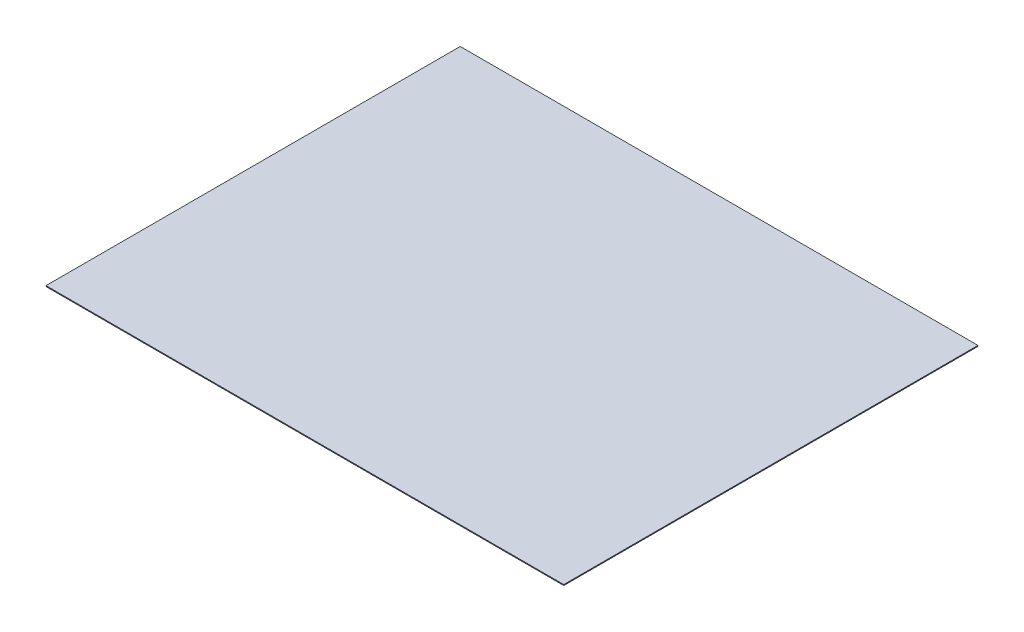
ISO-10303-21;
HEADER;
FILE_DESCRIPTION(('STEP AP214'),'2;1');
FILE_NAME('part.step','',(''),(''),'','','');
FILE_SCHEMA(('AUTOMOTIVE_DESIGN { 1 0 10303 214 1 1 1 1 }'));
ENDSEC;
DATA;
#1=APPLICATION_CONTEXT('core data for automotive mechanical design processes');
#2=APPLICATION_PROTOCOL_DEFINITION('international standard','automotive_design',2000,#1);
#3=PRODUCT_CONTEXT('',#1,'mechanical');
#4=PRODUCT('Part','Part','',(#3));
#5=PRODUCT_RELATED_PRODUCT_CATEGORY('part','',(#4));
#6=PRODUCT_DEFINITION_FORMATION('','',#4);
#7=PRODUCT_DEFINITION_CONTEXT('part definition',#1,'design');
#8=PRODUCT_DEFINITION('design','',#6,#7);
#9=PRODUCT_DEFINITION_SHAPE('','',#8);
#10=(LENGTH_UNIT() NAMED_UNIT(*) SI_UNIT(.MILLI.,.METRE.));
#11=(NAMED_UNIT(*) PLANE_ANGLE_UNIT() SI_UNIT($,.RADIAN.));
#12=(NAMED_UNIT(*) SI_UNIT($,.STERADIAN.) SOLID_ANGLE_UNIT());
#13=UNCERTAINTY_MEASURE_WITH_UNIT(LENGTH_MEASURE(1.E-05),#10,'distance_accuracy_value','');
#14=(GEOMETRIC_REPRESENTATION_CONTEXT(3) GLOBAL_UNCERTAINTY_ASSIGNED_CONTEXT((#13)) GLOBAL_UNIT_ASSIGNED_CONTEXT((#10,
#11,#12)) REPRESENTATION_CONTEXT('',''));
#15=CARTESIAN_POINT('',(0.,0.,0.));
#16=DIRECTION('',(0.,0.,1.));
#17=DIRECTION('',(1.,0.,0.));
#18=AXIS2_PLACEMENT_3D('',#15,#16,#17);
#19=CARTESIAN_POINT('',(762.,2.54,-609.6));
#20=DIRECTION('',(-1.,0.,0.));
#21=DIRECTION('',(0.,0.,1.));
#22=AXIS2_PLACEMENT_3D('',#19,#20,#21);
#23=PLANE('',#22);
#24=DIRECTION('',(0.,0.,-1.));
#25=VECTOR('',#24,1.);
#26=CARTESIAN_POINT('',(762.,0.,-609.6));
#27=LINE('',#26,#25);
#28=CARTESIAN_POINT('',(762.,0.,609.6));
#29=VERTEX_POINT('',#28);
#30=CARTESIAN_POINT('',(762.,0.,-609.6));
#31=VERTEX_POINT('',#30);
#32=EDGE_CURVE('E96',#29,#31,#27,.T.);
#33=ORIENTED_EDGE('',*,*,#32,.T.);
#34=DIRECTION('',(0.,-1.,0.));
#35=VECTOR('',#34,1.);
#36=CARTESIAN_POINT('',(762.,2.54,-609.6));
#37=LINE('',#36,#35);
#38=CARTESIAN_POINT('',(762.,2.54,-609.6));
#39=VERTEX_POINT('',#38);
#40=EDGE_CURVE('E11',#39,#31,#37,.T.);
#41=ORIENTED_EDGE('',*,*,#40,.F.);
#42=DIRECTION('',(0.,0.,-1.));
#43=VECTOR('',#42,1.);
#44=CARTESIAN_POINT('',(762.,2.54,-609.6));
#45=LINE('',#44,#43);
#46=CARTESIAN_POINT('',(762.,2.54,609.6));
#47=VERTEX_POINT('',#46);
#48=EDGE_CURVE('E84',#47,#39,#45,.T.);
#49=ORIENTED_EDGE('',*,*,#48,.F.);
#50=DIRECTION('',(0.,-1.,0.));
#51=VECTOR('',#50,1.);
#52=CARTESIAN_POINT('',(762.,2.54,609.6));
#53=LINE('',#52,#51);
#54=EDGE_CURVE('E92',#47,#29,#53,.T.);
#55=ORIENTED_EDGE('',*,*,#54,.T.);
#56=EDGE_LOOP('',(#33,#41,#49,#55));
#57=FACE_BOUND('',#56,.T.);
#58=ADVANCED_FACE('F33',(#57),#23,.F.);
#59=CARTESIAN_POINT('',(-762.,2.54,-609.6));
#60=DIRECTION('',(0.,0.,1.));
#61=DIRECTION('',(1.,0.,0.));
#62=AXIS2_PLACEMENT_3D('',#59,#60,#61);
#63=PLANE('',#62);
#64=DIRECTION('',(-1.,0.,0.));
#65=VECTOR('',#64,1.);
#66=CARTESIAN_POINT('',(-762.,0.,-609.6));
#67=LINE('',#66,#65);
#68=CARTESIAN_POINT('',(-762.,0.,-609.6));
#69=VERTEX_POINT('',#68);
#70=EDGE_CURVE('E88',#31,#69,#67,.T.);
#71=ORIENTED_EDGE('',*,*,#70,.T.);
#72=DIRECTION('',(0.,-1.,0.));
#73=VECTOR('',#72,1.);
#74=CARTESIAN_POINT('',(-762.,2.54,-609.6));
#75=LINE('',#74,#73);
#76=CARTESIAN_POINT('',(-762.,2.54,-609.6));
#77=VERTEX_POINT('',#76);
#78=EDGE_CURVE('E41',#77,#69,#75,.T.);
#79=ORIENTED_EDGE('',*,*,#78,.F.);
#80=DIRECTION('',(-1.,0.,0.));
#81=VECTOR('',#80,1.);
#82=CARTESIAN_POINT('',(-762.,2.54,-609.6));
#83=LINE('',#82,#81);
#84=EDGE_CURVE('E79',#39,#77,#83,.T.);
#85=ORIENTED_EDGE('',*,*,#84,.F.);
#86=ORIENTED_EDGE('',*,*,#40,.T.);
#87=EDGE_LOOP('',(#71,#79,#85,#86));
#88=FACE_BOUND('',#87,.T.);
#89=ADVANCED_FACE('F87',(#88),#63,.F.);
#90=CARTESIAN_POINT('',(-762.,2.54,-609.6));
#91=DIRECTION('',(1.,0.,0.));
#92=DIRECTION('',(0.,0.,-1.));
#93=AXIS2_PLACEMENT_3D('',#90,#91,#92);
#94=PLANE('',#93);
#95=DIRECTION('',(0.,0.,1.));
#96=VECTOR('',#95,1.);
#97=CARTESIAN_POINT('',(-762.,0.,-609.6));
#98=LINE('',#97,#96);
#99=CARTESIAN_POINT('',(-762.,0.,609.6));
#100=VERTEX_POINT('',#99);
#101=EDGE_CURVE('E66',#69,#100,#98,.T.);
#102=ORIENTED_EDGE('',*,*,#101,.T.);
#103=DIRECTION('',(0.,-1.,0.));
#104=VECTOR('',#103,1.);
#105=CARTESIAN_POINT('',(-762.,2.54,609.6));
#106=LINE('',#105,#104);
#107=CARTESIAN_POINT('',(-762.,2.54,609.6));
#108=VERTEX_POINT('',#107);
#109=EDGE_CURVE('E89',#108,#100,#106,.T.);
#110=ORIENTED_EDGE('',*,*,#109,.F.);
#111=DIRECTION('',(0.,0.,1.));
#112=VECTOR('',#111,1.);
#113=CARTESIAN_POINT('',(-762.,2.54,-609.6));
#114=LINE('',#113,#112);
#115=EDGE_CURVE('E82',#77,#108,#114,.T.);
#116=ORIENTED_EDGE('',*,*,#115,.F.);
#117=ORIENTED_EDGE('',*,*,#78,.T.);
#118=EDGE_LOOP('',(#102,#110,#116,#117));
#119=FACE_BOUND('',#118,.T.);
#120=ADVANCED_FACE('F90',(#119),#94,.F.);
#121=CARTESIAN_POINT('',(-762.,2.54,609.6));
#122=DIRECTION('',(0.,0.,-1.));
#123=DIRECTION('',(-1.,0.,0.));
#124=AXIS2_PLACEMENT_3D('',#121,#122,#123);
#125=PLANE('',#124);
#126=DIRECTION('',(1.,0.,0.));
#127=VECTOR('',#126,1.);
#128=CARTESIAN_POINT('',(-762.,0.,609.6));
#129=LINE('',#128,#127);
#130=EDGE_CURVE('E72',#100,#29,#129,.T.);
#131=ORIENTED_EDGE('',*,*,#130,.T.);
#132=ORIENTED_EDGE('',*,*,#54,.F.);
#133=DIRECTION('',(1.,0.,0.));
#134=VECTOR('',#133,1.);
#135=CARTESIAN_POINT('',(-762.,2.54,609.6));
#136=LINE('',#135,#134);
#137=EDGE_CURVE('E49',#108,#47,#136,.T.);
#138=ORIENTED_EDGE('',*,*,#137,.F.);
#139=ORIENTED_EDGE('',*,*,#109,.T.);
#140=EDGE_LOOP('',(#131,#132,#138,#139));
#141=FACE_BOUND('',#140,.T.);
#142=ADVANCED_FACE('F103',(#141),#125,.F.);
#143=CARTESIAN_POINT('',(0.,2.54,0.));
#144=DIRECTION('',(0.,1.,0.));
#145=DIRECTION('',(0.,0.,1.));
#146=AXIS2_PLACEMENT_3D('',#143,#144,#145);
#147=PLANE('',#146);
#148=ORIENTED_EDGE('',*,*,#48,.T.);
#149=ORIENTED_EDGE('',*,*,#84,.T.);
#150=ORIENTED_EDGE('',*,*,#115,.T.);
#151=ORIENTED_EDGE('',*,*,#137,.T.);
#152=EDGE_LOOP('',(#148,#149,#150,#151));
#153=FACE_BOUND('',#152,.T.);
#154=ADVANCED_FACE('F80',(#153),#147,.T.);
#155=CARTESIAN_POINT('',(0.,0.,0.));
#156=DIRECTION('',(0.,1.,0.));
#157=DIRECTION('',(0.,0.,1.));
#158=AXIS2_PLACEMENT_3D('',#155,#156,#157);
#159=PLANE('',#158);
#160=ORIENTED_EDGE('',*,*,#32,.F.);
#161=ORIENTED_EDGE('',*,*,#130,.F.);
#162=ORIENTED_EDGE('',*,*,#101,.F.);
#163=ORIENTED_EDGE('',*,*,#70,.F.);
#164=EDGE_LOOP('',(#160,#161,#162,#163));
#165=FACE_BOUND('',#164,.T.);
#166=ADVANCED_FACE('F106',(#165),#159,.F.);
#167=CLOSED_SHELL('',(#58,#89,#120,#142,#154,#166));
#168=MANIFOLD_SOLID_BREP('B2',#167);
#169=ADVANCED_BREP_SHAPE_REPRESENTATION('',(#18,#168),#14);
#170=SHAPE_DEFINITION_REPRESENTATION(#9,#169);
ENDSEC;
END-ISO-10303-21;
